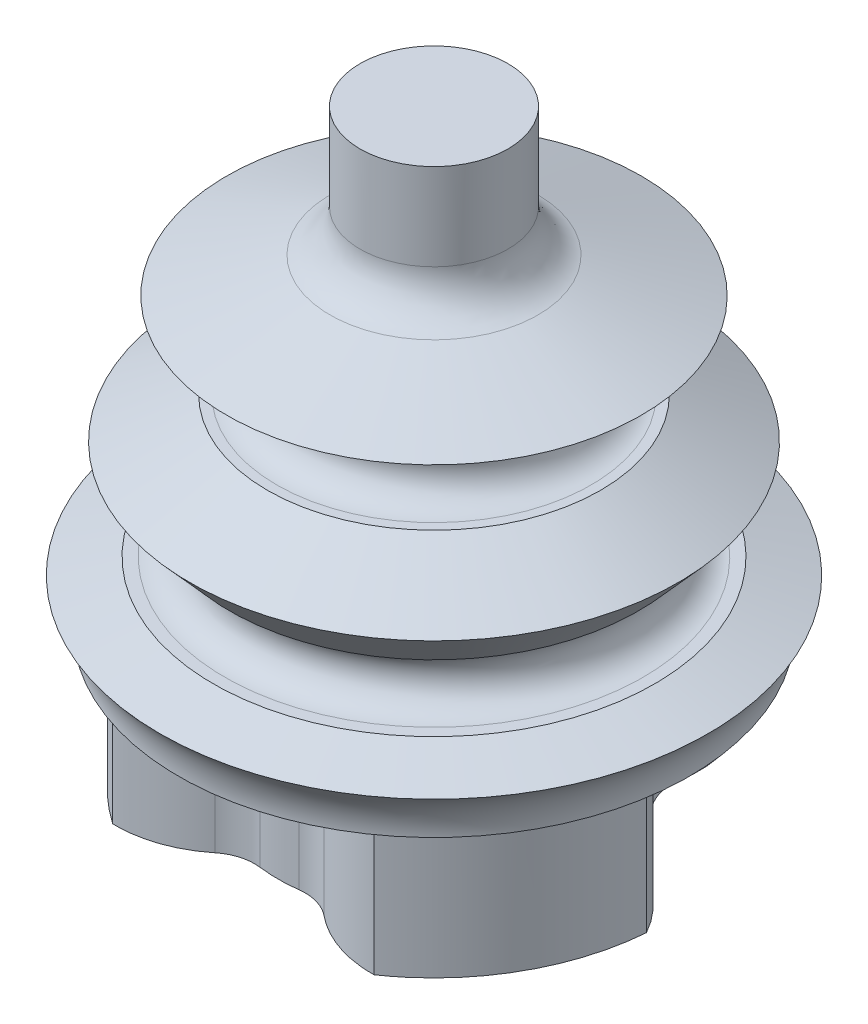
ISO-10303-21;
HEADER;
FILE_DESCRIPTION(('STEP AP214'),'2;1');
FILE_NAME('part.step','',(''),(''),'','','');
FILE_SCHEMA(('AUTOMOTIVE_DESIGN { 1 0 10303 214 1 1 1 1 }'));
ENDSEC;
DATA;
#1=APPLICATION_CONTEXT('core data for automotive mechanical design processes');
#2=APPLICATION_PROTOCOL_DEFINITION('international standard','automotive_design',2000,#1);
#3=PRODUCT_CONTEXT('',#1,'mechanical');
#4=PRODUCT('Part','Part','',(#3));
#5=PRODUCT_RELATED_PRODUCT_CATEGORY('part','',(#4));
#6=PRODUCT_DEFINITION_FORMATION('','',#4);
#7=PRODUCT_DEFINITION_CONTEXT('part definition',#1,'design');
#8=PRODUCT_DEFINITION('design','',#6,#7);
#9=PRODUCT_DEFINITION_SHAPE('','',#8);
#10=(LENGTH_UNIT() NAMED_UNIT(*) SI_UNIT(.MILLI.,.METRE.));
#11=(NAMED_UNIT(*) PLANE_ANGLE_UNIT() SI_UNIT($,.RADIAN.));
#12=(NAMED_UNIT(*) SI_UNIT($,.STERADIAN.) SOLID_ANGLE_UNIT());
#13=UNCERTAINTY_MEASURE_WITH_UNIT(LENGTH_MEASURE(1.E-05),#10,'distance_accuracy_value','');
#14=(GEOMETRIC_REPRESENTATION_CONTEXT(3) GLOBAL_UNCERTAINTY_ASSIGNED_CONTEXT((#13)) GLOBAL_UNIT_ASSIGNED_CONTEXT((#10,
#11,#12)) REPRESENTATION_CONTEXT('',''));
#15=CARTESIAN_POINT('',(0.,0.,0.));
#16=DIRECTION('',(0.,0.,1.));
#17=DIRECTION('',(1.,0.,0.));
#18=AXIS2_PLACEMENT_3D('',#15,#16,#17);
#19=CARTESIAN_POINT('',(0.,81.28,0.));
#20=DIRECTION('',(0.,-1.,0.));
#21=DIRECTION('',(0.,0.,-1.));
#22=AXIS2_PLACEMENT_3D('',#19,#20,#21);
#23=PLANE('',#22);
#24=CARTESIAN_POINT('',(0.,81.28,0.));
#25=DIRECTION('',(0.,-1.,0.));
#26=DIRECTION('',(0.,0.,1.));
#27=AXIS2_PLACEMENT_3D('',#24,#25,#26);
#28=CIRCLE('',#27,10.16);
#29=CARTESIAN_POINT('',(0.,81.28,10.16));
#30=VERTEX_POINT('',#29);
#31=CARTESIAN_POINT('',(-10.16,81.28,0.));
#32=VERTEX_POINT('',#31);
#33=EDGE_CURVE('E424',#30,#32,#28,.T.);
#34=ORIENTED_EDGE('',*,*,#33,.F.);
#35=CARTESIAN_POINT('',(0.,81.28,0.));
#36=DIRECTION('',(0.,-1.,0.));
#37=DIRECTION('',(1.,0.,0.));
#38=AXIS2_PLACEMENT_3D('',#35,#36,#37);
#39=CIRCLE('',#38,10.16);
#40=CARTESIAN_POINT('',(10.16,81.28,0.));
#41=VERTEX_POINT('',#40);
#42=EDGE_CURVE('E55',#41,#30,#39,.T.);
#43=ORIENTED_EDGE('',*,*,#42,.F.);
#44=CARTESIAN_POINT('',(0.,81.28,0.));
#45=DIRECTION('',(0.,-1.,0.));
#46=DIRECTION('',(0.,0.,-1.));
#47=AXIS2_PLACEMENT_3D('',#44,#45,#46);
#48=CIRCLE('',#47,10.16);
#49=EDGE_CURVE('E232',#32,#41,#48,.T.);
#50=ORIENTED_EDGE('',*,*,#49,.F.);
#51=EDGE_LOOP('',(#34,#43,#50));
#52=FACE_BOUND('',#51,.T.);
#53=ADVANCED_FACE('F37',(#52),#23,.F.);
#54=CARTESIAN_POINT('',(0.,0.,0.));
#55=DIRECTION('',(0.,1.,0.));
#56=DIRECTION('',(0.,0.,1.));
#57=AXIS2_PLACEMENT_3D('',#54,#55,#56);
#58=PLANE('',#57);
#59=CARTESIAN_POINT('',(7.49253541099746,0.,22.6004376438599));
#60=CARTESIAN_POINT('',(6.99308354361002,0.,22.1947435994573));
#61=CARTESIAN_POINT('',(6.42191231834273,0.,21.8972344947321));
#62=CARTESIAN_POINT('',(5.8514703844045,0.,21.6001052600017));
#63=CARTESIAN_POINT('',(5.23194573047124,0.,21.4232007457033));
#64=CARTESIAN_POINT('',(4.6134787991203,0.,21.2465982628067));
#65=CARTESIAN_POINT('',(3.97105556344913,0.,21.1976248999755));
#66=CARTESIAN_POINT('',(3.32945200346162,0.,21.1487140228585));
#67=CARTESIAN_POINT('',(2.69054762424453,0.,21.2296856720001));
#68=B_SPLINE_CURVE_WITH_KNOTS('',2,(#59,#60,#61,#62,#63,#64,#65,#66,#67),.UNSPECIFIED.,.F.,.F.,
(3,2,2,2,3),(0.,0.25,0.5,0.75,1.),.UNSPECIFIED.);
#69=CARTESIAN_POINT('',(7.49253541099746,0.,22.6004376438599));
#70=VERTEX_POINT('',#69);
#71=CARTESIAN_POINT('',(2.69054762424453,0.,21.2296856720001));
#72=VERTEX_POINT('',#71);
#73=EDGE_CURVE('E252',#70,#72,#68,.T.);
#74=ORIENTED_EDGE('',*,*,#73,.T.);
#75=CARTESIAN_POINT('',(3.73312492030209E-12,0.,5.52335954751015E-12));
#76=DIRECTION('',(0.,-1.,0.));
#77=DIRECTION('',(0.,0.,-1.));
#78=AXIS2_PLACEMENT_3D('',#75,#76,#77);
#79=CIRCLE('',#78,21.3995);
#80=CARTESIAN_POINT('',(-2.69054762763091,0.,21.22968567157));
#81=VERTEX_POINT('',#80);
#82=EDGE_CURVE('E523',#72,#81,#79,.T.);
#83=ORIENTED_EDGE('',*,*,#82,.T.);
#84=CARTESIAN_POINT('',(-2.69054762763091,0.,21.22968567157));
#85=CARTESIAN_POINT('',(-3.32890076368534,0.,21.1487838842155));
#86=CARTESIAN_POINT('',(-3.97105556683299,0.,21.1976248993409));
#87=CARTESIAN_POINT('',(-4.61239044436147,0.,21.2464035525571));
#88=CARTESIAN_POINT('',(-5.23194573389357,0.,21.4232007448683));
#89=CARTESIAN_POINT('',(-5.85044324855968,0.,21.599696089016));
#90=CARTESIAN_POINT('',(-6.42191232184276,0.,21.8972344937091));
#91=CARTESIAN_POINT('',(-6.99265225073815,0.,22.1943932655086));
#92=CARTESIAN_POINT('',(-7.49253541461106,0.,22.6004376426687));
#93=B_SPLINE_CURVE_WITH_KNOTS('',2,(#84,#85,#86,#87,#88,#89,#90,#91,#92),.UNSPECIFIED.,.F.,.F.,
(3,2,2,2,3),(0.,0.25,0.5,0.75,1.),.UNSPECIFIED.);
#94=CARTESIAN_POINT('',(-7.49253541461106,0.,22.6004376426687));
#95=VERTEX_POINT('',#94);
#96=EDGE_CURVE('E428',#81,#95,#93,.T.);
#97=ORIENTED_EDGE('',*,*,#96,.T.);
#98=CARTESIAN_POINT('',(-7.49253541461106,0.,22.6004376426687));
#99=CARTESIAN_POINT('',(-8.0443823437866,0.,23.0486910723477));
#100=CARTESIAN_POINT('',(-8.6339796873295,0.,23.4464961067625));
#101=CARTESIAN_POINT('',(-9.21956948976736,0.,23.8415972279989));
#102=CARTESIAN_POINT('',(-9.83863544994872,0.,24.1841138200821));
#103=CARTESIAN_POINT('',(-10.4543920337772,0.,24.5247994016056));
#104=CARTESIAN_POINT('',(-11.0987193621599,0.,24.8106261514912));
#105=CARTESIAN_POINT('',(-11.7408246996496,0.,25.095467215364));
#106=CARTESIAN_POINT('',(-12.4064480836543,0.,25.3233684698533));
#107=CARTESIAN_POINT('',(-13.071063476181,0.,25.5509246004665));
#108=CARTESIAN_POINT('',(-13.754038274123,0.,25.7196761440322));
#109=CARTESIAN_POINT('',(-14.4373023639388,0.,25.8884991667366));
#110=CARTESIAN_POINT('',(-15.1337065932573,0.,25.9968845428917));
#111=CARTESIAN_POINT('',(-15.8317346790815,0.,26.1055226491291));
#112=CARTESIAN_POINT('',(-16.5376697007483,0.,26.1523290352953));
#113=CARTESIAN_POINT('',(-17.2468246649463,0.,26.1993489168527));
#114=CARTESIAN_POINT('',(-17.9581442562873,0.,26.1833449901068));
#115=B_SPLINE_CURVE_WITH_KNOTS('',2,(#98,#99,#100,#101,#102,#103,#104,#105,#106,#107,#108,#109,
#110,#111,#112,#113,#114),.UNSPECIFIED.,.F.,.F.,(3,2,2,2,2,2,2,2,3),(0.,0.125,0.25,0.375,0.5,
0.625,0.75,0.875,1.),.UNSPECIFIED.);
#116=CARTESIAN_POINT('',(-17.9581442562873,0.,26.1833449901068));
#117=VERTEX_POINT('',#116);
#118=EDGE_CURVE('E342',#95,#117,#115,.T.);
#119=ORIENTED_EDGE('',*,*,#118,.T.);
#120=CARTESIAN_POINT('',(-17.9581442562873,0.,26.1833449901068));
#121=CARTESIAN_POINT('',(-19.4192304566649,0.,25.181242441056));
#122=CARTESIAN_POINT('',(-20.7601700978253,0.,24.0224444532585));
#123=CARTESIAN_POINT('',(-22.100486140041,0.,22.8641853601138));
#124=CARTESIAN_POINT('',(-23.3043401347251,0.,21.5631683869862));
#125=CARTESIAN_POINT('',(-24.5074470450385,0.,20.2629587953608));
#126=CARTESIAN_POINT('',(-25.559053999123,0.,18.8360627167765));
#127=CARTESIAN_POINT('',(-26.6100083498723,0.,17.4100521374145));
#128=CARTESIAN_POINT('',(-27.4963065708784,0.,15.8749999987603));
#129=CARTESIAN_POINT('',(-28.3820547754073,0.,14.3409004784794));
#130=CARTESIAN_POINT('',(-29.0920358207146,0.,12.7167586989203));
#131=CARTESIAN_POINT('',(-29.8015762679785,0.,11.0936248247063));
#132=CARTESIAN_POINT('',(-30.3264216774204,0.,9.40056637886966));
#133=CARTESIAN_POINT('',(-30.8509413797556,0.,7.70855860654183));
#134=CARTESIAN_POINT('',(-31.1841322069693,0.,5.96761246215319));
#135=CARTESIAN_POINT('',(-31.5171681252837,0.,4.22747572795575));
#136=CARTESIAN_POINT('',(-31.6545140458436,0.,2.46053663285387));
#137=B_SPLINE_CURVE_WITH_KNOTS('',2,(#120,#121,#122,#123,#124,#125,#126,#127,#128,#129,#130,
#131,#132,#133,#134,#135,#136),.UNSPECIFIED.,.F.,.F.,(3,2,2,2,2,2,2,2,3),(0.,0.125,0.25,0.375,
0.5,0.625,0.75,0.875,1.),.UNSPECIFIED.);
#138=CARTESIAN_POINT('',(-31.6545140458436,0.,2.46053663285388));
#139=VERTEX_POINT('',#138);
#140=EDGE_CURVE('E349',#117,#139,#137,.T.);
#141=ORIENTED_EDGE('',*,*,#140,.T.);
#142=CARTESIAN_POINT('',(-17.5976362053693,0.,10.1599999992164));
#143=DIRECTION('',(0.,-1.,0.));
#144=DIRECTION('',(0.,0.,-1.));
#145=AXIS2_PLACEMENT_3D('',#142,#143,#144);
#146=CIRCLE('',#145,16.0273999997497);
#147=CARTESIAN_POINT('',(-23.3188208420658,0.,-4.81149281562363));
#148=VERTEX_POINT('',#147);
#149=EDGE_CURVE('E247',#139,#148,#146,.T.);
#150=ORIENTED_EDGE('',*,*,#149,.T.);
#151=CARTESIAN_POINT('',(-25.5855342480823,0.,-10.7431460704072));
#152=DIRECTION('',(0.,1.,0.));
#153=DIRECTION('',(0.,0.,-1.));
#154=AXIS2_PLACEMENT_3D('',#151,#152,#153);
#155=CIRCLE('',#154,6.34999999999997);
#156=CARTESIAN_POINT('',(-19.7307209190021,0.,-8.28476024193675));
#157=VERTEX_POINT('',#156);
#158=EDGE_CURVE('E197',#148,#157,#155,.T.);
#159=ORIENTED_EDGE('',*,*,#158,.T.);
#160=CARTESIAN_POINT('',(-1.70696790036118E-12,0.,8.71525074330748E-12));
#161=DIRECTION('',(0.,-1.,0.));
#162=DIRECTION('',(0.,0.,-1.));
#163=AXIS2_PLACEMENT_3D('',#160,#161,#162);
#164=CIRCLE('',#163,21.3995);
#165=CARTESIAN_POINT('',(-17.0401732940327,0.,-12.9449254288762));
#166=VERTEX_POINT('',#165);
#167=EDGE_CURVE('E192',#157,#166,#164,.T.);
#168=ORIENTED_EDGE('',*,*,#167,.T.);
#169=CARTESIAN_POINT('',(-22.0966045385524,0.,-16.7861495917501));
#170=DIRECTION('',(0.,1.,0.));
#171=DIRECTION('',(0.,0.,-1.));
#172=AXIS2_PLACEMENT_3D('',#169,#170,#171);
#173=CIRCLE('',#172,6.35000000000002);
#174=CARTESIAN_POINT('',(-15.8262854305166,0.,-17.7889448267813));
#175=VERTEX_POINT('',#174);
#176=EDGE_CURVE('E187',#166,#175,#173,.T.);
#177=ORIENTED_EDGE('',*,*,#176,.T.);
#178=CARTESIAN_POINT('',(-1.83426884792226E-09,0.,-20.3200000000002));
#179=DIRECTION('',(0.,-1.,0.));
#180=DIRECTION('',(0.,0.,-1.));
#181=AXIS2_PLACEMENT_3D('',#178,#179,#180);
#182=CIRCLE('',#181,16.0274);
#183=CARTESIAN_POINT('',(-13.6963697936226,0.,-28.6438816237733));
#184=VERTEX_POINT('',#183);
#185=EDGE_CURVE('E182',#175,#184,#182,.T.);
#186=ORIENTED_EDGE('',*,*,#185,.T.);
#187=CARTESIAN_POINT('',(-4.57966997657877E-12,0.,2.72004641033163E-12));
#188=DIRECTION('',(0.,-1.,0.));
#189=DIRECTION('',(0.,0.,-1.));
#190=AXIS2_PLACEMENT_3D('',#187,#188,#189);
#191=CIRCLE('',#190,31.7500000000067);
#192=CARTESIAN_POINT('',(13.6963697884654,0.,-28.6438816262349));
#193=VERTEX_POINT('',#192);
#194=EDGE_CURVE('E177',#184,#193,#191,.T.);
#195=ORIENTED_EDGE('',*,*,#194,.T.);
#196=CARTESIAN_POINT('',(-1.83426537847531E-09,0.,-20.3200000000122));
#197=DIRECTION('',(0.,-1.,0.));
#198=DIRECTION('',(0.,0.,-1.));
#199=AXIS2_PLACEMENT_3D('',#196,#197,#198);
#200=CIRCLE('',#199,16.0274);
#201=CARTESIAN_POINT('',(15.8262854273046,0.,-17.7889448296479));
#202=VERTEX_POINT('',#201);
#203=EDGE_CURVE('E156',#193,#202,#200,.T.);
#204=ORIENTED_EDGE('',*,*,#203,.T.);
#205=CARTESIAN_POINT('',(22.0966045355212,0.,-16.7861495957476));
#206=DIRECTION('',(0.,1.,0.));
#207=DIRECTION('',(0.,0.,-1.));
#208=AXIS2_PLACEMENT_3D('',#205,#206,#207);
#209=CIRCLE('',#208,6.34999999999998);
#210=CARTESIAN_POINT('',(17.0401732916945,0.,-12.9449254319617));
#211=VERTEX_POINT('',#210);
#212=EDGE_CURVE('E166',#202,#211,#209,.T.);
#213=ORIENTED_EDGE('',*,*,#212,.T.);
#214=CARTESIAN_POINT('',(-1.70002900645727E-12,0.,-3.30291349825984E-12));
#215=DIRECTION('',(0.,-1.,0.));
#216=DIRECTION('',(0.,0.,-1.));
#217=AXIS2_PLACEMENT_3D('',#214,#215,#216);
#218=CIRCLE('',#217,21.3995);
#219=CARTESIAN_POINT('',(19.730720920134,0.,-8.28476023924504));
#220=VERTEX_POINT('',#219);
#221=EDGE_CURVE('E599',#211,#220,#218,.T.);
#222=ORIENTED_EDGE('',*,*,#221,.T.);
#223=CARTESIAN_POINT('',(25.5855342495534,0.,-10.7431460669077));
#224=DIRECTION('',(0.,1.,0.));
#225=DIRECTION('',(0.,0.,-1.));
#226=AXIS2_PLACEMENT_3D('',#223,#224,#225);
#227=CIRCLE('',#226,6.35);
#228=CARTESIAN_POINT('',(23.3188208427071,0.,-4.81149281244122));
#229=VERTEX_POINT('',#228);
#230=EDGE_CURVE('E47',#220,#229,#227,.T.);
#231=ORIENTED_EDGE('',*,*,#230,.T.);
#232=CARTESIAN_POINT('',(17.5976362038528,0.,10.1600000018194));
#233=DIRECTION('',(0.,-1.,0.));
#234=DIRECTION('',(0.,0.,-1.));
#235=AXIS2_PLACEMENT_3D('',#232,#233,#234);
#236=CIRCLE('',#235,16.0273999999788);
#237=CARTESIAN_POINT('',(31.6545140455146,0.,2.46053663714801));
#238=VERTEX_POINT('',#237);
#239=EDGE_CURVE('E267',#229,#238,#236,.T.);
#240=ORIENTED_EDGE('',*,*,#239,.T.);
#241=CARTESIAN_POINT('',(31.6545140455146,0.,2.46053663714801));
#242=CARTESIAN_POINT('',(31.5172108809441,0.,4.226925678373));
#243=CARTESIAN_POINT('',(31.1841322061441,0.,5.96761246648531));
#244=CARTESIAN_POINT('',(30.8512084283295,0.,7.70748975475214));
#245=CARTESIAN_POINT('',(30.3264216760868,0.,9.40056638318155));
#246=CARTESIAN_POINT('',(29.8019605945499,0.,11.0925923268169));
#247=CARTESIAN_POINT('',(29.0920358188671,0.,12.7167587031515));
#248=CARTESIAN_POINT('',(28.3825516063493,0.,14.3399171587829));
#249=CARTESIAN_POINT('',(27.4963065685189,0.,15.8750000028489));
#250=CARTESIAN_POINT('',(26.6106115142108,0.,17.409130209401));
#251=CARTESIAN_POINT('',(25.559053996261,0.,18.8360627206601));
#252=CARTESIAN_POINT('',(24.5081490509897,0.,20.2621097100577));
#253=CARTESIAN_POINT('',(23.3043401313775,0.,21.5631683906028));
#254=CARTESIAN_POINT('',(22.1012782681928,0.,22.8634196637315));
#255=CARTESIAN_POINT('',(20.760170094017,0.,24.0224444565475));
#256=CARTESIAN_POINT('',(19.4196854351852,0.,25.1809303892206));
#257=CARTESIAN_POINT('',(17.9581442520505,0.,26.1833449930098));
#258=B_SPLINE_CURVE_WITH_KNOTS('',2,(#241,#242,#243,#244,#245,#246,#247,#248,#249,#250,#251,
#252,#253,#254,#255,#256,#257),.UNSPECIFIED.,.F.,.F.,(3,2,2,2,2,2,2,2,3),(0.,0.125,0.25,0.375,
0.5,0.625,0.75,0.875,1.),.UNSPECIFIED.);
#259=CARTESIAN_POINT('',(17.9581442520505,0.,26.1833449930098));
#260=VERTEX_POINT('',#259);
#261=EDGE_CURVE('E980',#238,#260,#258,.T.);
#262=ORIENTED_EDGE('',*,*,#261,.T.);
#263=CARTESIAN_POINT('',(17.9581442520505,0.,26.1833449930098));
#264=CARTESIAN_POINT('',(17.2522567192399,0.,26.1992267041528));
#265=CARTESIAN_POINT('',(16.547158133257,0.,26.1529373987672));
#266=CARTESIAN_POINT('',(15.84288234954,0.,26.106702109864));
#267=CARTESIAN_POINT('',(15.1443173311314,0.,25.9985219425881));
#268=CARTESIAN_POINT('',(14.4468393553992,0.,25.8905101153457));
#269=CARTESIAN_POINT('',(13.7604993526751,0.,25.7212959486474));
#270=CARTESIAN_POINT('',(13.0752273691631,0.,25.5523450974782));
#271=CARTESIAN_POINT('',(12.4064342035498,0.,25.3234090034736));
#272=CARTESIAN_POINT('',(11.7386817523431,0.,25.0948291587602));
#273=CARTESIAN_POINT('',(11.092621188536,0.,24.8079462882402));
#274=CARTESIAN_POINT('',(10.4475659647449,0.,24.5215098384518));
#275=CARTESIAN_POINT('',(9.8292475008261,0.,24.1789046565354));
#276=CARTESIAN_POINT('',(9.2118912072074,0.,23.8368326052789));
#277=CARTESIAN_POINT('',(8.62610923140396,0.,23.4411616431037));
#278=CARTESIAN_POINT('',(8.04101037896211,0.,23.0459521018818));
#279=CARTESIAN_POINT('',(7.49253541099745,0.,22.6004376438599));
#280=B_SPLINE_CURVE_WITH_KNOTS('',2,(#263,#264,#265,#266,#267,#268,#269,#270,#271,#272,#273,
#274,#275,#276,#277,#278,#279),.UNSPECIFIED.,.F.,.F.,(3,2,2,2,2,2,2,2,3),(0.,0.125,0.25,0.375,
0.5,0.625,0.75,0.875,1.),.UNSPECIFIED.);
#281=EDGE_CURVE('E253',#260,#70,#280,.T.);
#282=ORIENTED_EDGE('',*,*,#281,.T.);
#283=EDGE_LOOP('',(#74,#83,#97,#119,#141,#150,#159,#168,#177,#186,#195,#204,#213,#222,#231,#240,
#262,#282));
#284=FACE_BOUND('',#283,.T.);
#285=ADVANCED_FACE('F417',(#284),#58,.F.);
#286=CARTESIAN_POINT('',(17.5976362038528,25.4,10.1600000018194));
#287=DIRECTION('',(0.,-1.,0.));
#288=DIRECTION('',(0.,0.,-1.));
#289=AXIS2_PLACEMENT_3D('',#286,#287,#288);
#290=CYLINDRICAL_SURFACE('',#289,16.0273999999788);
#291=CARTESIAN_POINT('',(17.5976362038528,19.05,10.1600000018194));
#292=DIRECTION('',(0.,1.,0.));
#293=DIRECTION('',(0.,0.,1.));
#294=AXIS2_PLACEMENT_3D('',#291,#292,#293);
#295=CIRCLE('',#294,16.0273999999788);
#296=CARTESIAN_POINT('',(31.6545140455146,19.05,2.46053663714801));
#297=VERTEX_POINT('',#296);
#298=CARTESIAN_POINT('',(23.3188208427071,19.05,-4.81149281244122));
#299=VERTEX_POINT('',#298);
#300=EDGE_CURVE('E570',#297,#299,#295,.T.);
#301=ORIENTED_EDGE('',*,*,#300,.F.);
#302=DIRECTION('',(0.,-1.,0.));
#303=VECTOR('',#302,1.);
#304=CARTESIAN_POINT('',(31.6545140455146,25.4,2.46053663714801));
#305=LINE('',#304,#303);
#306=EDGE_CURVE('E568',#297,#238,#305,.T.);
#307=ORIENTED_EDGE('',*,*,#306,.T.);
#308=ORIENTED_EDGE('',*,*,#239,.F.);
#309=DIRECTION('',(0.,-1.,0.));
#310=VECTOR('',#309,1.);
#311=CARTESIAN_POINT('',(23.3188208427071,25.4,-4.81149281244122));
#312=LINE('',#311,#310);
#313=EDGE_CURVE('E273',#299,#229,#312,.T.);
#314=ORIENTED_EDGE('',*,*,#313,.F.);
#315=EDGE_LOOP('',(#301,#307,#308,#314));
#316=FACE_BOUND('',#315,.T.);
#317=ADVANCED_FACE('F422',(#316),#290,.T.);
#318=CARTESIAN_POINT('',(0.,25.4,0.));
#319=DIRECTION('',(0.,-1.,0.));
#320=DIRECTION('',(0.,0.,-1.));
#321=AXIS2_PLACEMENT_3D('',#318,#319,#320);
#322=CYLINDRICAL_SURFACE('',#321,31.7500000000067);
#323=CARTESIAN_POINT('',(0.,19.05,0.));
#324=DIRECTION('',(0.,1.,0.));
#325=DIRECTION('',(0.,0.,1.));
#326=AXIS2_PLACEMENT_3D('',#323,#324,#325);
#327=CIRCLE('',#326,31.7500000000067);
#328=CARTESIAN_POINT('',(17.9581442520505,19.05,26.1833449930098));
#329=VERTEX_POINT('',#328);
#330=EDGE_CURVE('E566',#329,#297,#327,.T.);
#331=ORIENTED_EDGE('',*,*,#330,.F.);
#332=DIRECTION('',(0.,-1.,0.));
#333=VECTOR('',#332,1.);
#334=CARTESIAN_POINT('',(17.9581442520505,25.4,26.1833449930098));
#335=LINE('',#334,#333);
#336=EDGE_CURVE('E563',#329,#260,#335,.T.);
#337=ORIENTED_EDGE('',*,*,#336,.T.);
#338=ORIENTED_EDGE('',*,*,#261,.F.);
#339=ORIENTED_EDGE('',*,*,#306,.F.);
#340=EDGE_LOOP('',(#331,#337,#338,#339));
#341=FACE_BOUND('',#340,.T.);
#342=ADVANCED_FACE('F439',(#341),#322,.T.);
#343=CARTESIAN_POINT('',(17.5976362038631,25.4,10.1600000018254));
#344=DIRECTION('',(0.,-1.,0.));
#345=DIRECTION('',(0.,0.,-1.));
#346=AXIS2_PLACEMENT_3D('',#343,#344,#345);
#347=CYLINDRICAL_SURFACE('',#346,16.0273999999789);
#348=CARTESIAN_POINT('',(17.5976362038631,19.05,10.1600000018254));
#349=DIRECTION('',(0.,1.,0.));
#350=DIRECTION('',(0.,0.,1.));
#351=AXIS2_PLACEMENT_3D('',#348,#349,#350);
#352=CIRCLE('',#351,16.0273999999789);
#353=CARTESIAN_POINT('',(7.49253541099745,19.05,22.6004376438599));
#354=VERTEX_POINT('',#353);
#355=EDGE_CURVE('E560',#354,#329,#352,.T.);
#356=ORIENTED_EDGE('',*,*,#355,.F.);
#357=DIRECTION('',(0.,-1.,0.));
#358=VECTOR('',#357,1.);
#359=CARTESIAN_POINT('',(7.49253541099745,25.4,22.6004376438599));
#360=LINE('',#359,#358);
#361=EDGE_CURVE('E558',#354,#70,#360,.T.);
#362=ORIENTED_EDGE('',*,*,#361,.T.);
#363=ORIENTED_EDGE('',*,*,#281,.F.);
#364=ORIENTED_EDGE('',*,*,#336,.F.);
#365=EDGE_LOOP('',(#356,#362,#363,#364));
#366=FACE_BOUND('',#365,.T.);
#367=ADVANCED_FACE('F310',(#366),#347,.T.);
#368=CARTESIAN_POINT('',(3.48892970858898,25.4,27.5292956636899));
#369=DIRECTION('',(0.,-1.,0.));
#370=DIRECTION('',(0.,0.,-1.));
#371=AXIS2_PLACEMENT_3D('',#368,#369,#370);
#372=CYLINDRICAL_SURFACE('',#371,6.35000000000004);
#373=CARTESIAN_POINT('',(3.48892970858898,19.05,27.5292956636899));
#374=DIRECTION('',(0.,1.,0.));
#375=DIRECTION('',(0.,0.,1.));
#376=AXIS2_PLACEMENT_3D('',#373,#374,#375);
#377=CIRCLE('',#376,6.35000000000004);
#378=CARTESIAN_POINT('',(2.69054762424453,19.05,21.2296856720001));
#379=VERTEX_POINT('',#378);
#380=EDGE_CURVE('E555',#379,#354,#377,.F.);
#381=ORIENTED_EDGE('',*,*,#380,.F.);
#382=DIRECTION('',(0.,-1.,0.));
#383=VECTOR('',#382,1.);
#384=CARTESIAN_POINT('',(2.69054762424453,25.4,21.2296856720001));
#385=LINE('',#384,#383);
#386=EDGE_CURVE('E553',#379,#72,#385,.T.);
#387=ORIENTED_EDGE('',*,*,#386,.T.);
#388=ORIENTED_EDGE('',*,*,#73,.F.);
#389=ORIENTED_EDGE('',*,*,#361,.F.);
#390=EDGE_LOOP('',(#381,#387,#388,#389));
#391=FACE_BOUND('',#390,.T.);
#392=ADVANCED_FACE('F300',(#391),#372,.F.);
#393=CARTESIAN_POINT('',(3.73312492030209E-12,25.4,5.52335954751015E-12));
#394=DIRECTION('',(0.,-1.,0.));
#395=DIRECTION('',(0.,0.,-1.));
#396=AXIS2_PLACEMENT_3D('',#393,#394,#395);
#397=CYLINDRICAL_SURFACE('',#396,21.3995);
#398=CARTESIAN_POINT('',(3.73312492030209E-12,19.05,5.52335954751015E-12));
#399=DIRECTION('',(0.,1.,0.));
#400=DIRECTION('',(0.,0.,1.));
#401=AXIS2_PLACEMENT_3D('',#398,#399,#400);
#402=CIRCLE('',#401,21.3995);
#403=CARTESIAN_POINT('',(-2.69054762763091,19.05,21.22968567157));
#404=VERTEX_POINT('',#403);
#405=EDGE_CURVE('E549',#404,#379,#402,.T.);
#406=ORIENTED_EDGE('',*,*,#405,.F.);
#407=DIRECTION('',(0.,-1.,0.));
#408=VECTOR('',#407,1.);
#409=CARTESIAN_POINT('',(-2.69054762763091,25.4,21.22968567157));
#410=LINE('',#409,#408);
#411=EDGE_CURVE('E546',#404,#81,#410,.T.);
#412=ORIENTED_EDGE('',*,*,#411,.T.);
#413=ORIENTED_EDGE('',*,*,#82,.F.);
#414=ORIENTED_EDGE('',*,*,#386,.F.);
#415=EDGE_LOOP('',(#406,#412,#413,#414));
#416=FACE_BOUND('',#415,.T.);
#417=ADVANCED_FACE('F309',(#416),#397,.T.);
#418=CARTESIAN_POINT('',(-3.48892971298245,25.4,27.5292956631322));
#419=DIRECTION('',(0.,-1.,0.));
#420=DIRECTION('',(0.,0.,-1.));
#421=AXIS2_PLACEMENT_3D('',#418,#419,#420);
#422=CYLINDRICAL_SURFACE('',#421,6.35000000000002);
#423=CARTESIAN_POINT('',(-3.48892971298245,19.05,27.5292956631322));
#424=DIRECTION('',(0.,1.,0.));
#425=DIRECTION('',(0.,0.,1.));
#426=AXIS2_PLACEMENT_3D('',#423,#424,#425);
#427=CIRCLE('',#426,6.35000000000002);
#428=CARTESIAN_POINT('',(-7.49253541461107,19.05,22.6004376426687));
#429=VERTEX_POINT('',#428);
#430=EDGE_CURVE('E550',#429,#404,#427,.F.);
#431=ORIENTED_EDGE('',*,*,#430,.F.);
#432=DIRECTION('',(0.,-1.,0.));
#433=VECTOR('',#432,1.);
#434=CARTESIAN_POINT('',(-7.49253541461107,25.4,22.6004376426687));
#435=LINE('',#434,#433);
#436=EDGE_CURVE('E254',#429,#95,#435,.T.);
#437=ORIENTED_EDGE('',*,*,#436,.T.);
#438=ORIENTED_EDGE('',*,*,#96,.F.);
#439=ORIENTED_EDGE('',*,*,#411,.F.);
#440=EDGE_LOOP('',(#431,#437,#438,#439));
#441=FACE_BOUND('',#440,.T.);
#442=ADVANCED_FACE('F314',(#441),#422,.F.);
#443=CARTESIAN_POINT('',(-17.5976362053638,25.4,10.1599999992132));
#444=DIRECTION('',(0.,-1.,0.));
#445=DIRECTION('',(0.,0.,-1.));
#446=AXIS2_PLACEMENT_3D('',#443,#444,#445);
#447=CYLINDRICAL_SURFACE('',#446,16.0273999997497);
#448=CARTESIAN_POINT('',(-17.5976362053638,19.05,10.1599999992132));
#449=DIRECTION('',(0.,1.,0.));
#450=DIRECTION('',(0.,0.,1.));
#451=AXIS2_PLACEMENT_3D('',#448,#449,#450);
#452=CIRCLE('',#451,16.0273999997497);
#453=CARTESIAN_POINT('',(-17.9581442562873,19.05,26.1833449901068));
#454=VERTEX_POINT('',#453);
#455=EDGE_CURVE('E127',#454,#429,#452,.T.);
#456=ORIENTED_EDGE('',*,*,#455,.F.);
#457=DIRECTION('',(0.,-1.,0.));
#458=VECTOR('',#457,1.);
#459=CARTESIAN_POINT('',(-17.9581442562873,25.4,26.1833449901068));
#460=LINE('',#459,#458);
#461=EDGE_CURVE('E237',#454,#117,#460,.T.);
#462=ORIENTED_EDGE('',*,*,#461,.T.);
#463=ORIENTED_EDGE('',*,*,#118,.F.);
#464=ORIENTED_EDGE('',*,*,#436,.F.);
#465=EDGE_LOOP('',(#456,#462,#463,#464));
#466=FACE_BOUND('',#465,.T.);
#467=ADVANCED_FACE('F319',(#466),#447,.T.);
#468=CARTESIAN_POINT('',(1.76594849854439E-12,25.4,8.46545056276682E-12));
#469=DIRECTION('',(0.,-1.,0.));
#470=DIRECTION('',(0.,0.,-1.));
#471=AXIS2_PLACEMENT_3D('',#468,#469,#470);
#472=CYLINDRICAL_SURFACE('',#471,31.7500000000031);
#473=CARTESIAN_POINT('',(1.76594849854439E-12,19.05,8.46545056276682E-12));
#474=DIRECTION('',(0.,1.,0.));
#475=DIRECTION('',(0.,0.,1.));
#476=AXIS2_PLACEMENT_3D('',#473,#474,#475);
#477=CIRCLE('',#476,31.7500000000031);
#478=CARTESIAN_POINT('',(-31.6545140458436,19.05,2.46053663285388));
#479=VERTEX_POINT('',#478);
#480=EDGE_CURVE('E240',#479,#454,#477,.T.);
#481=ORIENTED_EDGE('',*,*,#480,.F.);
#482=DIRECTION('',(0.,-1.,0.));
#483=VECTOR('',#482,1.);
#484=CARTESIAN_POINT('',(-31.6545140458436,25.4,2.46053663285388));
#485=LINE('',#484,#483);
#486=EDGE_CURVE('E239',#479,#139,#485,.T.);
#487=ORIENTED_EDGE('',*,*,#486,.T.);
#488=ORIENTED_EDGE('',*,*,#140,.F.);
#489=ORIENTED_EDGE('',*,*,#461,.F.);
#490=EDGE_LOOP('',(#481,#487,#488,#489));
#491=FACE_BOUND('',#490,.T.);
#492=ADVANCED_FACE('F324',(#491),#472,.T.);
#493=CARTESIAN_POINT('',(-17.5976362053693,25.4,10.1599999992164));
#494=DIRECTION('',(0.,-1.,0.));
#495=DIRECTION('',(0.,0.,-1.));
#496=AXIS2_PLACEMENT_3D('',#493,#494,#495);
#497=CYLINDRICAL_SURFACE('',#496,16.0273999997497);
#498=CARTESIAN_POINT('',(-17.5976362053693,19.05,10.1599999992164));
#499=DIRECTION('',(0.,1.,0.));
#500=DIRECTION('',(0.,0.,1.));
#501=AXIS2_PLACEMENT_3D('',#498,#499,#500);
#502=CIRCLE('',#501,16.0273999997497);
#503=CARTESIAN_POINT('',(-23.3188208420658,19.05,-4.81149281562363));
#504=VERTEX_POINT('',#503);
#505=EDGE_CURVE('E11',#504,#479,#502,.T.);
#506=ORIENTED_EDGE('',*,*,#505,.F.);
#507=DIRECTION('',(0.,-1.,0.));
#508=VECTOR('',#507,1.);
#509=CARTESIAN_POINT('',(-23.3188208420658,25.4,-4.81149281562363));
#510=LINE('',#509,#508);
#511=EDGE_CURVE('E590',#504,#148,#510,.T.);
#512=ORIENTED_EDGE('',*,*,#511,.T.);
#513=ORIENTED_EDGE('',*,*,#149,.F.);
#514=ORIENTED_EDGE('',*,*,#486,.F.);
#515=EDGE_LOOP('',(#506,#512,#513,#514));
#516=FACE_BOUND('',#515,.T.);
#517=ADVANCED_FACE('F456',(#516),#497,.T.);
#518=CARTESIAN_POINT('',(-25.5855342480823,25.4,-10.7431460704072));
#519=DIRECTION('',(0.,-1.,0.));
#520=DIRECTION('',(0.,0.,-1.));
#521=AXIS2_PLACEMENT_3D('',#518,#519,#520);
#522=CYLINDRICAL_SURFACE('',#521,6.34999999999997);
#523=CARTESIAN_POINT('',(-25.5855342480823,19.05,-10.7431460704072));
#524=DIRECTION('',(0.,1.,0.));
#525=DIRECTION('',(0.,0.,1.));
#526=AXIS2_PLACEMENT_3D('',#523,#524,#525);
#527=CIRCLE('',#526,6.34999999999997);
#528=CARTESIAN_POINT('',(-19.7307209190021,19.05,-8.28476024193675));
#529=VERTEX_POINT('',#528);
#530=EDGE_CURVE('E272',#529,#504,#527,.F.);
#531=ORIENTED_EDGE('',*,*,#530,.F.);
#532=DIRECTION('',(0.,-1.,0.));
#533=VECTOR('',#532,1.);
#534=CARTESIAN_POINT('',(-19.7307209190021,25.4,-8.28476024193675));
#535=LINE('',#534,#533);
#536=EDGE_CURVE('E193',#529,#157,#535,.T.);
#537=ORIENTED_EDGE('',*,*,#536,.T.);
#538=ORIENTED_EDGE('',*,*,#158,.F.);
#539=ORIENTED_EDGE('',*,*,#511,.F.);
#540=EDGE_LOOP('',(#531,#537,#538,#539));
#541=FACE_BOUND('',#540,.T.);
#542=ADVANCED_FACE('F452',(#541),#522,.F.);
#543=CARTESIAN_POINT('',(-1.70696790036118E-12,25.4,8.71525074330748E-12));
#544=DIRECTION('',(0.,-1.,0.));
#545=DIRECTION('',(0.,0.,-1.));
#546=AXIS2_PLACEMENT_3D('',#543,#544,#545);
#547=CYLINDRICAL_SURFACE('',#546,21.3995);
#548=CARTESIAN_POINT('',(-1.70696790036118E-12,19.05,8.71525074330748E-12));
#549=DIRECTION('',(0.,1.,0.));
#550=DIRECTION('',(0.,0.,1.));
#551=AXIS2_PLACEMENT_3D('',#548,#549,#550);
#552=CIRCLE('',#551,21.3995);
#553=CARTESIAN_POINT('',(-17.0401732940327,19.05,-12.9449254288762));
#554=VERTEX_POINT('',#553);
#555=EDGE_CURVE('E196',#554,#529,#552,.T.);
#556=ORIENTED_EDGE('',*,*,#555,.F.);
#557=DIRECTION('',(0.,-1.,0.));
#558=VECTOR('',#557,1.);
#559=CARTESIAN_POINT('',(-17.0401732940327,25.4,-12.9449254288762));
#560=LINE('',#559,#558);
#561=EDGE_CURVE('E188',#554,#166,#560,.T.);
#562=ORIENTED_EDGE('',*,*,#561,.T.);
#563=ORIENTED_EDGE('',*,*,#167,.F.);
#564=ORIENTED_EDGE('',*,*,#536,.F.);
#565=EDGE_LOOP('',(#556,#562,#563,#564));
#566=FACE_BOUND('',#565,.T.);
#567=ADVANCED_FACE('F455',(#566),#547,.T.);
#568=CARTESIAN_POINT('',(-22.0966045385524,25.4,-16.7861495917501));
#569=DIRECTION('',(0.,-1.,0.));
#570=DIRECTION('',(0.,0.,-1.));
#571=AXIS2_PLACEMENT_3D('',#568,#569,#570);
#572=CYLINDRICAL_SURFACE('',#571,6.35000000000002);
#573=CARTESIAN_POINT('',(-22.0966045385524,19.05,-16.7861495917501));
#574=DIRECTION('',(0.,1.,0.));
#575=DIRECTION('',(0.,0.,1.));
#576=AXIS2_PLACEMENT_3D('',#573,#574,#575);
#577=CIRCLE('',#576,6.35000000000002);
#578=CARTESIAN_POINT('',(-15.8262854305166,19.05,-17.7889448267813));
#579=VERTEX_POINT('',#578);
#580=EDGE_CURVE('E191',#579,#554,#577,.F.);
#581=ORIENTED_EDGE('',*,*,#580,.F.);
#582=DIRECTION('',(0.,-1.,0.));
#583=VECTOR('',#582,1.);
#584=CARTESIAN_POINT('',(-15.8262854305166,25.4,-17.7889448267813));
#585=LINE('',#584,#583);
#586=EDGE_CURVE('E183',#579,#175,#585,.T.);
#587=ORIENTED_EDGE('',*,*,#586,.T.);
#588=ORIENTED_EDGE('',*,*,#176,.F.);
#589=ORIENTED_EDGE('',*,*,#561,.F.);
#590=EDGE_LOOP('',(#581,#587,#588,#589));
#591=FACE_BOUND('',#590,.T.);
#592=ADVANCED_FACE('F460',(#591),#572,.F.);
#593=CARTESIAN_POINT('',(-1.83426884792226E-09,25.4,-20.3200000000002));
#594=DIRECTION('',(0.,-1.,0.));
#595=DIRECTION('',(0.,0.,-1.));
#596=AXIS2_PLACEMENT_3D('',#593,#594,#595);
#597=CYLINDRICAL_SURFACE('',#596,16.0274);
#598=CARTESIAN_POINT('',(-1.83426884792226E-09,19.05,-20.3200000000002));
#599=DIRECTION('',(0.,1.,0.));
#600=DIRECTION('',(0.,0.,1.));
#601=AXIS2_PLACEMENT_3D('',#598,#599,#600);
#602=CIRCLE('',#601,16.0274);
#603=CARTESIAN_POINT('',(-13.6963697936226,19.05,-28.6438816237733));
#604=VERTEX_POINT('',#603);
#605=EDGE_CURVE('E186',#604,#579,#602,.T.);
#606=ORIENTED_EDGE('',*,*,#605,.F.);
#607=DIRECTION('',(0.,-1.,0.));
#608=VECTOR('',#607,1.);
#609=CARTESIAN_POINT('',(-13.6963697936226,25.4,-28.6438816237733));
#610=LINE('',#609,#608);
#611=EDGE_CURVE('E178',#604,#184,#610,.T.);
#612=ORIENTED_EDGE('',*,*,#611,.T.);
#613=ORIENTED_EDGE('',*,*,#185,.F.);
#614=ORIENTED_EDGE('',*,*,#586,.F.);
#615=EDGE_LOOP('',(#606,#612,#613,#614));
#616=FACE_BOUND('',#615,.T.);
#617=ADVANCED_FACE('F464',(#616),#597,.T.);
#618=CARTESIAN_POINT('',(-4.57966997657877E-12,25.4,2.72004641033163E-12));
#619=DIRECTION('',(0.,-1.,0.));
#620=DIRECTION('',(0.,0.,-1.));
#621=AXIS2_PLACEMENT_3D('',#618,#619,#620);
#622=CYLINDRICAL_SURFACE('',#621,31.7500000000067);
#623=CARTESIAN_POINT('',(-4.57966997657877E-12,19.05,2.72004641033163E-12));
#624=DIRECTION('',(0.,1.,0.));
#625=DIRECTION('',(0.,0.,1.));
#626=AXIS2_PLACEMENT_3D('',#623,#624,#625);
#627=CIRCLE('',#626,31.7500000000067);
#628=CARTESIAN_POINT('',(13.6963697884654,19.05,-28.6438816262349));
#629=VERTEX_POINT('',#628);
#630=EDGE_CURVE('E181',#629,#604,#627,.T.);
#631=ORIENTED_EDGE('',*,*,#630,.F.);
#632=DIRECTION('',(0.,-1.,0.));
#633=VECTOR('',#632,1.);
#634=CARTESIAN_POINT('',(13.6963697884654,25.4,-28.6438816262349));
#635=LINE('',#634,#633);
#636=EDGE_CURVE('E154',#629,#193,#635,.T.);
#637=ORIENTED_EDGE('',*,*,#636,.T.);
#638=ORIENTED_EDGE('',*,*,#194,.F.);
#639=ORIENTED_EDGE('',*,*,#611,.F.);
#640=EDGE_LOOP('',(#631,#637,#638,#639));
#641=FACE_BOUND('',#640,.T.);
#642=ADVANCED_FACE('F468',(#641),#622,.T.);
#643=CARTESIAN_POINT('',(-1.83426537847531E-09,25.4,-20.3200000000122));
#644=DIRECTION('',(0.,-1.,0.));
#645=DIRECTION('',(0.,0.,-1.));
#646=AXIS2_PLACEMENT_3D('',#643,#644,#645);
#647=CYLINDRICAL_SURFACE('',#646,16.0274);
#648=CARTESIAN_POINT('',(-1.83426537847531E-09,19.05,-20.3200000000122));
#649=DIRECTION('',(0.,1.,0.));
#650=DIRECTION('',(0.,0.,1.));
#651=AXIS2_PLACEMENT_3D('',#648,#649,#650);
#652=CIRCLE('',#651,16.0274);
#653=CARTESIAN_POINT('',(15.8262854273046,19.05,-17.7889448296479));
#654=VERTEX_POINT('',#653);
#655=EDGE_CURVE('E147',#654,#629,#652,.T.);
#656=ORIENTED_EDGE('',*,*,#655,.F.);
#657=DIRECTION('',(0.,-1.,0.));
#658=VECTOR('',#657,1.);
#659=CARTESIAN_POINT('',(15.8262854273046,25.4,-17.7889448296479));
#660=LINE('',#659,#658);
#661=EDGE_CURVE('E151',#654,#202,#660,.T.);
#662=ORIENTED_EDGE('',*,*,#661,.T.);
#663=ORIENTED_EDGE('',*,*,#203,.F.);
#664=ORIENTED_EDGE('',*,*,#636,.F.);
#665=EDGE_LOOP('',(#656,#662,#663,#664));
#666=FACE_BOUND('',#665,.T.);
#667=ADVANCED_FACE('F149',(#666),#647,.T.);
#668=CARTESIAN_POINT('',(22.0966045355212,25.4,-16.7861495957476));
#669=DIRECTION('',(0.,-1.,0.));
#670=DIRECTION('',(0.,0.,-1.));
#671=AXIS2_PLACEMENT_3D('',#668,#669,#670);
#672=CYLINDRICAL_SURFACE('',#671,6.34999999999998);
#673=CARTESIAN_POINT('',(22.0966045355212,19.05,-16.7861495957476));
#674=DIRECTION('',(0.,1.,0.));
#675=DIRECTION('',(0.,0.,1.));
#676=AXIS2_PLACEMENT_3D('',#673,#674,#675);
#677=CIRCLE('',#676,6.34999999999998);
#678=CARTESIAN_POINT('',(17.0401732916945,19.05,-12.9449254319617));
#679=VERTEX_POINT('',#678);
#680=EDGE_CURVE('E159',#679,#654,#677,.F.);
#681=ORIENTED_EDGE('',*,*,#680,.F.);
#682=DIRECTION('',(0.,-1.,0.));
#683=VECTOR('',#682,1.);
#684=CARTESIAN_POINT('',(17.0401732916945,25.4,-12.9449254319617));
#685=LINE('',#684,#683);
#686=EDGE_CURVE('E174',#679,#211,#685,.T.);
#687=ORIENTED_EDGE('',*,*,#686,.T.);
#688=ORIENTED_EDGE('',*,*,#212,.F.);
#689=ORIENTED_EDGE('',*,*,#661,.F.);
#690=EDGE_LOOP('',(#681,#687,#688,#689));
#691=FACE_BOUND('',#690,.T.);
#692=ADVANCED_FACE('F168',(#691),#672,.F.);
#693=CARTESIAN_POINT('',(-1.70002900645727E-12,25.4,-3.30291349825984E-12));
#694=DIRECTION('',(0.,-1.,0.));
#695=DIRECTION('',(0.,0.,-1.));
#696=AXIS2_PLACEMENT_3D('',#693,#694,#695);
#697=CYLINDRICAL_SURFACE('',#696,21.3995);
#698=CARTESIAN_POINT('',(-1.70002900645727E-12,19.05,-3.30291349825984E-12));
#699=DIRECTION('',(0.,1.,0.));
#700=DIRECTION('',(0.,0.,1.));
#701=AXIS2_PLACEMENT_3D('',#698,#699,#700);
#702=CIRCLE('',#701,21.3995);
#703=CARTESIAN_POINT('',(19.730720920134,19.05,-8.28476023924504));
#704=VERTEX_POINT('',#703);
#705=EDGE_CURVE('E162',#704,#679,#702,.T.);
#706=ORIENTED_EDGE('',*,*,#705,.F.);
#707=DIRECTION('',(0.,-1.,0.));
#708=VECTOR('',#707,1.);
#709=CARTESIAN_POINT('',(19.730720920134,25.4,-8.28476023924504));
#710=LINE('',#709,#708);
#711=EDGE_CURVE('E602',#704,#220,#710,.T.);
#712=ORIENTED_EDGE('',*,*,#711,.T.);
#713=ORIENTED_EDGE('',*,*,#221,.F.);
#714=ORIENTED_EDGE('',*,*,#686,.F.);
#715=EDGE_LOOP('',(#706,#712,#713,#714));
#716=FACE_BOUND('',#715,.T.);
#717=ADVANCED_FACE('F477',(#716),#697,.T.);
#718=CARTESIAN_POINT('',(25.5855342495534,25.4,-10.7431460669077));
#719=DIRECTION('',(0.,-1.,0.));
#720=DIRECTION('',(0.,0.,-1.));
#721=AXIS2_PLACEMENT_3D('',#718,#719,#720);
#722=CYLINDRICAL_SURFACE('',#721,6.35);
#723=CARTESIAN_POINT('',(25.5855342495534,19.05,-10.7431460669077));
#724=DIRECTION('',(0.,1.,0.));
#725=DIRECTION('',(0.,0.,1.));
#726=AXIS2_PLACEMENT_3D('',#723,#724,#725);
#727=CIRCLE('',#726,6.35);
#728=EDGE_CURVE('E65',#299,#704,#727,.F.);
#729=ORIENTED_EDGE('',*,*,#728,.F.);
#730=ORIENTED_EDGE('',*,*,#313,.T.);
#731=ORIENTED_EDGE('',*,*,#230,.F.);
#732=ORIENTED_EDGE('',*,*,#711,.F.);
#733=EDGE_LOOP('',(#729,#730,#731,#732));
#734=FACE_BOUND('',#733,.T.);
#735=ADVANCED_FACE('F412',(#734),#722,.F.);
#736=CARTESIAN_POINT('',(35.052,19.05,0.));
#737=DIRECTION('',(0.,1.,0.));
#738=DIRECTION('',(0.,0.,1.));
#739=AXIS2_PLACEMENT_3D('',#736,#737,#738);
#740=PLANE('',#739);
#741=ORIENTED_EDGE('',*,*,#728,.T.);
#742=ORIENTED_EDGE('',*,*,#705,.T.);
#743=ORIENTED_EDGE('',*,*,#680,.T.);
#744=ORIENTED_EDGE('',*,*,#655,.T.);
#745=ORIENTED_EDGE('',*,*,#630,.T.);
#746=ORIENTED_EDGE('',*,*,#605,.T.);
#747=ORIENTED_EDGE('',*,*,#580,.T.);
#748=ORIENTED_EDGE('',*,*,#555,.T.);
#749=ORIENTED_EDGE('',*,*,#530,.T.);
#750=ORIENTED_EDGE('',*,*,#505,.T.);
#751=ORIENTED_EDGE('',*,*,#480,.T.);
#752=ORIENTED_EDGE('',*,*,#455,.T.);
#753=ORIENTED_EDGE('',*,*,#430,.T.);
#754=ORIENTED_EDGE('',*,*,#405,.T.);
#755=ORIENTED_EDGE('',*,*,#380,.T.);
#756=ORIENTED_EDGE('',*,*,#355,.T.);
#757=ORIENTED_EDGE('',*,*,#330,.T.);
#758=ORIENTED_EDGE('',*,*,#300,.T.);
#759=EDGE_LOOP('',(#741,#742,#743,#744,#745,#746,#747,#748,#749,#750,#751,#752,#753,#754,#755,
#756,#757,#758));
#760=FACE_BOUND('',#759,.T.);
#761=CARTESIAN_POINT('',(0.,19.05,0.));
#762=DIRECTION('',(0.,-1.,0.));
#763=DIRECTION('',(0.,0.,-1.));
#764=AXIS2_PLACEMENT_3D('',#761,#762,#763);
#765=CIRCLE('',#764,35.052);
#766=CARTESIAN_POINT('',(0.,19.05,-35.052));
#767=VERTEX_POINT('',#766);
#768=EDGE_CURVE('E201',#767,#767,#765,.T.);
#769=ORIENTED_EDGE('',*,*,#768,.T.);
#770=EDGE_LOOP('',(#769));
#771=FACE_BOUND('',#770,.T.);
#772=ADVANCED_FACE('F160',(#760,#771),#740,.F.);
#773=CARTESIAN_POINT('',(0.,19.05,0.));
#774=DIRECTION('',(0.,-1.,0.));
#775=DIRECTION('',(0.,0.,-1.));
#776=AXIS2_PLACEMENT_3D('',#773,#774,#775);
#777=TOROIDAL_SURFACE('',#776,44.196,9.14399999999999);
#778=ORIENTED_EDGE('',*,*,#768,.F.);
#779=EDGE_LOOP('',(#778));
#780=FACE_BOUND('',#779,.T.);
#781=CARTESIAN_POINT('',(0.,25.4550940110844,0.));
#782=DIRECTION('',(0.,-1.,0.));
#783=DIRECTION('',(0.,0.,-1.));
#784=AXIS2_PLACEMENT_3D('',#781,#782,#783);
#785=CIRCLE('',#784,37.6700895877149);
#786=CARTESIAN_POINT('',(0.,25.4550940110844,-37.6700895877149));
#787=VERTEX_POINT('',#786);
#788=EDGE_CURVE('E198',#787,#787,#785,.T.);
#789=ORIENTED_EDGE('',*,*,#788,.T.);
#790=EDGE_LOOP('',(#789));
#791=FACE_BOUND('',#790,.T.);
#792=ADVANCED_FACE('F405',(#780,#791),#777,.F.);
#793=CARTESIAN_POINT('',(0.,27.6988544155834,0.));
#794=DIRECTION('',(0.,-1.,0.));
#795=DIRECTION('',(0.,0.,-1.));
#796=AXIS2_PLACEMENT_3D('',#793,#794,#795);
#797=CONICAL_SURFACE('',#796,30.3158399829222,1.27466985663072);
#798=ORIENTED_EDGE('',*,*,#788,.F.);
#799=EDGE_LOOP('',(#798));
#800=FACE_BOUND('',#799,.T.);
#801=CARTESIAN_POINT('',(0.,27.6988544155834,0.));
#802=DIRECTION('',(0.,-1.,0.));
#803=DIRECTION('',(0.,0.,-1.));
#804=AXIS2_PLACEMENT_3D('',#801,#802,#803);
#805=CIRCLE('',#804,30.3158399829222);
#806=CARTESIAN_POINT('',(0.,27.6988544155834,-30.3158399829222));
#807=VERTEX_POINT('',#806);
#808=EDGE_CURVE('E202',#807,#807,#805,.T.);
#809=ORIENTED_EDGE('',*,*,#808,.T.);
#810=EDGE_LOOP('',(#809));
#811=FACE_BOUND('',#810,.T.);
#812=ADVANCED_FACE('F402',(#800,#811),#797,.T.);
#813=CARTESIAN_POINT('',(30.3158399829222,27.6988544155834,0.));
#814=DIRECTION('',(0.,-1.,0.));
#815=DIRECTION('',(0.,0.,-1.));
#816=AXIS2_PLACEMENT_3D('',#813,#814,#815);
#817=PLANE('',#816);
#818=ORIENTED_EDGE('',*,*,#808,.F.);
#819=EDGE_LOOP('',(#818));
#820=FACE_BOUND('',#819,.T.);
#821=CARTESIAN_POINT('',(0.,27.6988544155834,0.));
#822=DIRECTION('',(0.,-1.,0.));
#823=DIRECTION('',(0.,0.,-1.));
#824=AXIS2_PLACEMENT_3D('',#821,#822,#823);
#825=CIRCLE('',#824,28.7384637860728);
#826=CARTESIAN_POINT('',(0.,27.6988544155834,-28.7384637860728));
#827=VERTEX_POINT('',#826);
#828=EDGE_CURVE('E205',#827,#827,#825,.T.);
#829=ORIENTED_EDGE('',*,*,#828,.T.);
#830=EDGE_LOOP('',(#829));
#831=FACE_BOUND('',#830,.T.);
#832=ADVANCED_FACE('F398',(#820,#831),#817,.F.);
#833=CARTESIAN_POINT('',(0.,31.5088544155834,0.));
#834=DIRECTION('',(0.,-1.,0.));
#835=DIRECTION('',(0.,0.,-1.));
#836=AXIS2_PLACEMENT_3D('',#833,#834,#835);
#837=TOROIDAL_SURFACE('',#836,28.7384637860728,3.81);
#838=ORIENTED_EDGE('',*,*,#828,.F.);
#839=EDGE_LOOP('',(#838));
#840=FACE_BOUND('',#839,.T.);
#841=CARTESIAN_POINT('',(0.,35.2627494878309,0.));
#842=DIRECTION('',(0.,-1.,0.));
#843=DIRECTION('',(0.,0.,-1.));
#844=AXIS2_PLACEMENT_3D('',#841,#842,#843);
#845=CIRCLE('',#844,28.0870255414511);
#846=CARTESIAN_POINT('',(0.,35.2627494878309,-28.0870255414511));
#847=VERTEX_POINT('',#846);
#848=EDGE_CURVE('E208',#847,#847,#845,.T.);
#849=ORIENTED_EDGE('',*,*,#848,.T.);
#850=EDGE_LOOP('',(#849));
#851=FACE_BOUND('',#850,.T.);
#852=ADVANCED_FACE('F394',(#840,#851),#837,.F.);
#853=CARTESIAN_POINT('',(0.,41.3903561127133,0.));
#854=DIRECTION('',(0.,1.,0.));
#855=DIRECTION('',(0.,0.,1.));
#856=AXIS2_PLACEMENT_3D('',#853,#854,#855);
#857=CONICAL_SURFACE('',#856,33.5667696989437,0.729641171732229);
#858=ORIENTED_EDGE('',*,*,#848,.F.);
#859=EDGE_LOOP('',(#858));
#860=FACE_BOUND('',#859,.T.);
#861=CARTESIAN_POINT('',(0.,41.3903561127133,0.));
#862=DIRECTION('',(0.,-1.,0.));
#863=DIRECTION('',(0.,0.,-1.));
#864=AXIS2_PLACEMENT_3D('',#861,#862,#863);
#865=CIRCLE('',#864,33.5667696989437);
#866=CARTESIAN_POINT('',(0.,41.3903561127133,-33.5667696989437));
#867=VERTEX_POINT('',#866);
#868=EDGE_CURVE('E211',#867,#867,#865,.T.);
#869=ORIENTED_EDGE('',*,*,#868,.T.);
#870=EDGE_LOOP('',(#869));
#871=FACE_BOUND('',#870,.T.);
#872=ADVANCED_FACE('F390',(#860,#871),#857,.T.);
#873=CARTESIAN_POINT('',(0.,47.0028544155834,0.));
#874=DIRECTION('',(0.,-1.,0.));
#875=DIRECTION('',(0.,0.,-1.));
#876=AXIS2_PLACEMENT_3D('',#873,#874,#875);
#877=CONICAL_SURFACE('',#876,22.8708708582791,1.0875581283573);
#878=ORIENTED_EDGE('',*,*,#868,.F.);
#879=EDGE_LOOP('',(#878));
#880=FACE_BOUND('',#879,.T.);
#881=CARTESIAN_POINT('',(0.,47.0028544155834,0.));
#882=DIRECTION('',(0.,-1.,0.));
#883=DIRECTION('',(0.,0.,-1.));
#884=AXIS2_PLACEMENT_3D('',#881,#882,#883);
#885=CIRCLE('',#884,22.8708708582791);
#886=CARTESIAN_POINT('',(0.,47.0028544155834,-22.8708708582791));
#887=VERTEX_POINT('',#886);
#888=EDGE_CURVE('E214',#887,#887,#885,.T.);
#889=ORIENTED_EDGE('',*,*,#888,.T.);
#890=EDGE_LOOP('',(#889));
#891=FACE_BOUND('',#890,.T.);
#892=ADVANCED_FACE('F386',(#880,#891),#877,.T.);
#893=CARTESIAN_POINT('',(22.8708708582791,47.0028544155834,0.));
#894=DIRECTION('',(0.,-1.,0.));
#895=DIRECTION('',(0.,0.,-1.));
#896=AXIS2_PLACEMENT_3D('',#893,#894,#895);
#897=PLANE('',#896);
#898=ORIENTED_EDGE('',*,*,#888,.F.);
#899=EDGE_LOOP('',(#898));
#900=FACE_BOUND('',#899,.T.);
#901=CARTESIAN_POINT('',(0.,47.0028544155834,0.));
#902=DIRECTION('',(0.,-1.,0.));
#903=DIRECTION('',(0.,0.,-1.));
#904=AXIS2_PLACEMENT_3D('',#901,#902,#903);
#905=CIRCLE('',#904,21.59);
#906=CARTESIAN_POINT('',(0.,47.0028544155834,-21.59));
#907=VERTEX_POINT('',#906);
#908=EDGE_CURVE('E217',#907,#907,#905,.T.);
#909=ORIENTED_EDGE('',*,*,#908,.T.);
#910=EDGE_LOOP('',(#909));
#911=FACE_BOUND('',#910,.T.);
#912=ADVANCED_FACE('F382',(#900,#911),#897,.F.);
#913=CARTESIAN_POINT('',(0.,50.8128544155834,0.));
#914=DIRECTION('',(0.,-1.,0.));
#915=DIRECTION('',(0.,0.,-1.));
#916=AXIS2_PLACEMENT_3D('',#913,#914,#915);
#917=TOROIDAL_SURFACE('',#916,21.59,3.81);
#918=ORIENTED_EDGE('',*,*,#908,.F.);
#919=EDGE_LOOP('',(#918));
#920=FACE_BOUND('',#919,.T.);
#921=CARTESIAN_POINT('',(0.,54.6221389559436,0.));
#922=DIRECTION('',(0.,-1.,0.));
#923=DIRECTION('',(0.,0.,-1.));
#924=AXIS2_PLACEMENT_3D('',#921,#922,#923);
#925=CIRCLE('',#924,21.5161671443546);
#926=CARTESIAN_POINT('',(0.,54.6221389559436,-21.5161671443546));
#927=VERTEX_POINT('',#926);
#928=EDGE_CURVE('E220',#927,#927,#925,.T.);
#929=ORIENTED_EDGE('',*,*,#928,.T.);
#930=EDGE_LOOP('',(#929));
#931=FACE_BOUND('',#930,.T.);
#932=ADVANCED_FACE('F378',(#920,#931),#917,.F.);
#933=CARTESIAN_POINT('',(0.,58.7484063952086,0.));
#934=DIRECTION('',(0.,1.,0.));
#935=DIRECTION('',(0.,0.,1.));
#936=AXIS2_PLACEMENT_3D('',#933,#934,#935);
#937=CONICAL_SURFACE('',#936,28.4856705256458,1.0362457947121);
#938=ORIENTED_EDGE('',*,*,#928,.F.);
#939=EDGE_LOOP('',(#938));
#940=FACE_BOUND('',#939,.T.);
#941=CARTESIAN_POINT('',(0.,58.7484063952086,0.));
#942=DIRECTION('',(0.,-1.,0.));
#943=DIRECTION('',(0.,0.,-1.));
#944=AXIS2_PLACEMENT_3D('',#941,#942,#943);
#945=CIRCLE('',#944,28.4856705256458);
#946=CARTESIAN_POINT('',(0.,58.7484063952086,-28.4856705256458));
#947=VERTEX_POINT('',#946);
#948=EDGE_CURVE('E223',#947,#947,#945,.T.);
#949=ORIENTED_EDGE('',*,*,#948,.T.);
#950=EDGE_LOOP('',(#949));
#951=FACE_BOUND('',#950,.T.);
#952=ADVANCED_FACE('F374',(#940,#951),#937,.T.);
#953=CARTESIAN_POINT('',(0.,63.5845238450325,0.));
#954=DIRECTION('',(0.,-1.,0.));
#955=DIRECTION('',(0.,0.,-1.));
#956=AXIS2_PLACEMENT_3D('',#953,#954,#955);
#957=CONICAL_SURFACE('',#956,14.2901665618455,1.24244884068721);
#958=ORIENTED_EDGE('',*,*,#948,.F.);
#959=EDGE_LOOP('',(#958));
#960=FACE_BOUND('',#959,.T.);
#961=CARTESIAN_POINT('',(0.,63.5845238450325,0.));
#962=DIRECTION('',(0.,-1.,0.));
#963=DIRECTION('',(0.,0.,-1.));
#964=AXIS2_PLACEMENT_3D('',#961,#962,#963);
#965=CIRCLE('',#964,14.2901665618455);
#966=CARTESIAN_POINT('',(0.,63.5845238450325,-14.2901665618455));
#967=VERTEX_POINT('',#966);
#968=EDGE_CURVE('E226',#967,#967,#965,.T.);
#969=ORIENTED_EDGE('',*,*,#968,.T.);
#970=EDGE_LOOP('',(#969));
#971=FACE_BOUND('',#970,.T.);
#972=ADVANCED_FACE('F370',(#960,#971),#957,.T.);
#973=CARTESIAN_POINT('',(0.,69.3548544155834,0.));
#974=DIRECTION('',(0.,-1.,0.));
#975=DIRECTION('',(0.,0.,-1.));
#976=AXIS2_PLACEMENT_3D('',#973,#974,#975);
#977=TOROIDAL_SURFACE('',#976,16.256,6.096);
#978=ORIENTED_EDGE('',*,*,#968,.F.);
#979=EDGE_LOOP('',(#978));
#980=FACE_BOUND('',#979,.T.);
#981=CARTESIAN_POINT('',(0.,69.3548544155834,0.));
#982=DIRECTION('',(0.,-1.,0.));
#983=DIRECTION('',(0.,0.,-1.));
#984=AXIS2_PLACEMENT_3D('',#981,#982,#983);
#985=CIRCLE('',#984,10.16);
#986=CARTESIAN_POINT('',(0.,69.3548544155834,-10.16));
#987=VERTEX_POINT('',#986);
#988=EDGE_CURVE('E229',#987,#987,#985,.T.);
#989=ORIENTED_EDGE('',*,*,#988,.T.);
#990=EDGE_LOOP('',(#989));
#991=FACE_BOUND('',#990,.T.);
#992=ADVANCED_FACE('F366',(#980,#991),#977,.F.);
#993=CARTESIAN_POINT('',(0.,0.,0.));
#994=DIRECTION('',(0.,-1.,0.));
#995=DIRECTION('',(0.,0.,-1.));
#996=AXIS2_PLACEMENT_3D('',#993,#994,#995);
#997=CYLINDRICAL_SURFACE('',#996,10.16);
#998=ORIENTED_EDGE('',*,*,#988,.F.);
#999=EDGE_LOOP('',(#998));
#1000=FACE_BOUND('',#999,.T.);
#1001=ORIENTED_EDGE('',*,*,#49,.T.);
#1002=ORIENTED_EDGE('',*,*,#42,.T.);
#1003=ORIENTED_EDGE('',*,*,#33,.T.);
#1004=EDGE_LOOP('',(#1001,#1002,#1003));
#1005=FACE_BOUND('',#1004,.T.);
#1006=ADVANCED_FACE('F357',(#1000,#1005),#997,.T.);
#1007=CLOSED_SHELL('',(#53,#285,#317,#342,#367,#392,#417,#442,#467,#492,#517,#542,#567,#592,
#617,#642,#667,#692,#717,#735,#772,#792,#812,#832,#852,#872,#892,#912,#932,#952,#972,#992,#1006));
#1008=MANIFOLD_SOLID_BREP('B2',#1007);
#1009=ADVANCED_BREP_SHAPE_REPRESENTATION('',(#18,#1008),#14);
#1010=SHAPE_DEFINITION_REPRESENTATION(#9,#1009);
ENDSEC;
END-ISO-10303-21;
